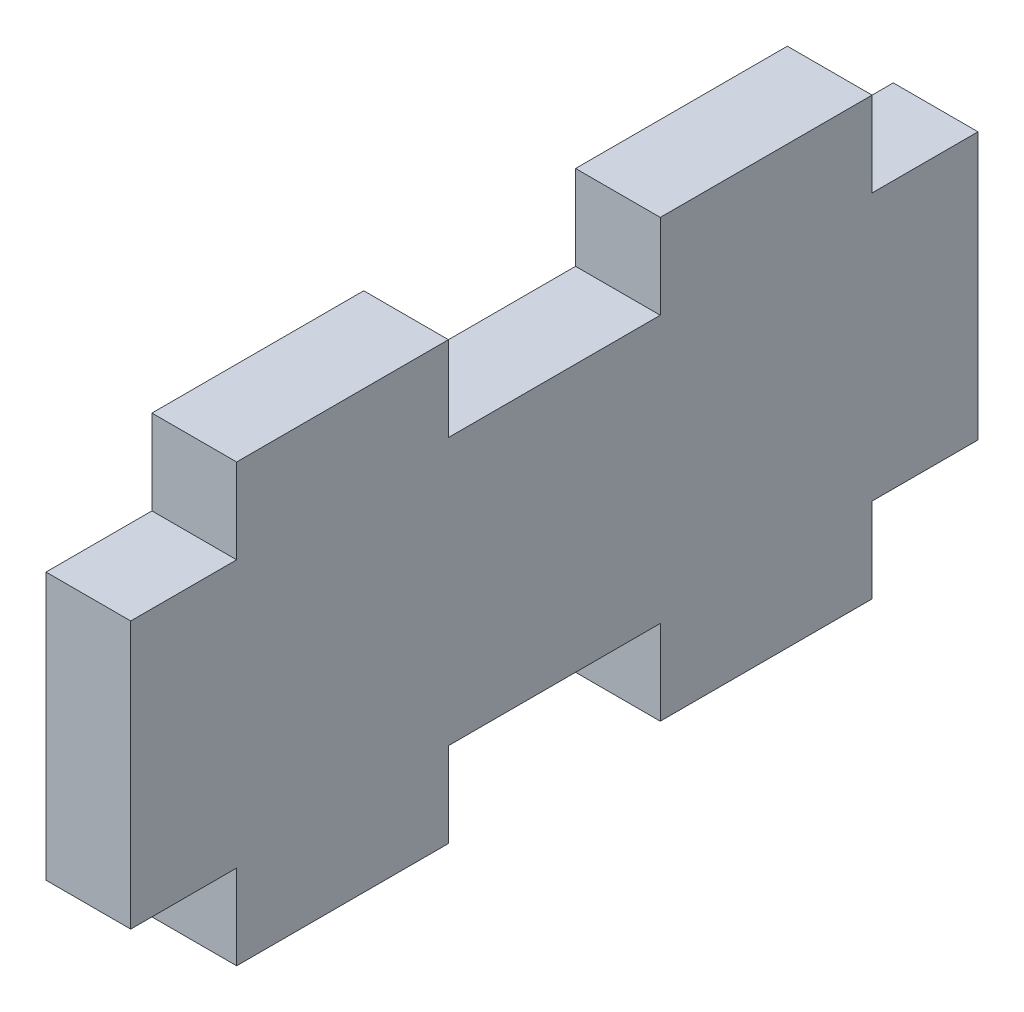
ISO-10303-21;
HEADER;
FILE_DESCRIPTION(('STEP AP214'),'2;1');
FILE_NAME('part.step','',(''),(''),'','','');
FILE_SCHEMA(('AUTOMOTIVE_DESIGN { 1 0 10303 214 1 1 1 1 }'));
ENDSEC;
DATA;
#1=APPLICATION_CONTEXT('core data for automotive mechanical design processes');
#2=APPLICATION_PROTOCOL_DEFINITION('international standard','automotive_design',2000,#1);
#3=PRODUCT_CONTEXT('',#1,'mechanical');
#4=PRODUCT('Part','Part','',(#3));
#5=PRODUCT_RELATED_PRODUCT_CATEGORY('part','',(#4));
#6=PRODUCT_DEFINITION_FORMATION('','',#4);
#7=PRODUCT_DEFINITION_CONTEXT('part definition',#1,'design');
#8=PRODUCT_DEFINITION('design','',#6,#7);
#9=PRODUCT_DEFINITION_SHAPE('','',#8);
#10=(LENGTH_UNIT() NAMED_UNIT(*) SI_UNIT(.MILLI.,.METRE.));
#11=(NAMED_UNIT(*) PLANE_ANGLE_UNIT() SI_UNIT($,.RADIAN.));
#12=(NAMED_UNIT(*) SI_UNIT($,.STERADIAN.) SOLID_ANGLE_UNIT());
#13=UNCERTAINTY_MEASURE_WITH_UNIT(LENGTH_MEASURE(1.E-05),#10,'distance_accuracy_value','');
#14=(GEOMETRIC_REPRESENTATION_CONTEXT(3) GLOBAL_UNCERTAINTY_ASSIGNED_CONTEXT((#13)) GLOBAL_UNIT_ASSIGNED_CONTEXT((#10,
#11,#12)) REPRESENTATION_CONTEXT('',''));
#15=CARTESIAN_POINT('',(0.,0.,0.));
#16=DIRECTION('',(0.,0.,1.));
#17=DIRECTION('',(1.,0.,0.));
#18=AXIS2_PLACEMENT_3D('',#15,#16,#17);
#19=CARTESIAN_POINT('',(2.,-3.15,-7.5));
#20=DIRECTION('',(0.,1.,0.));
#21=DIRECTION('',(0.,0.,1.));
#22=AXIS2_PLACEMENT_3D('',#19,#20,#21);
#23=PLANE('',#22);
#24=DIRECTION('',(0.,0.,-1.));
#25=VECTOR('',#24,1.);
#26=CARTESIAN_POINT('',(0.,-3.15,-7.5));
#27=LINE('',#26,#25);
#28=CARTESIAN_POINT('',(0.,-3.15,-7.5));
#29=VERTEX_POINT('',#28);
#30=CARTESIAN_POINT('',(0.,-3.15,-10.));
#31=VERTEX_POINT('',#30);
#32=EDGE_CURVE('E201',#29,#31,#27,.T.);
#33=ORIENTED_EDGE('',*,*,#32,.T.);
#34=DIRECTION('',(-1.,0.,0.));
#35=VECTOR('',#34,1.);
#36=CARTESIAN_POINT('',(2.,-3.15,-10.));
#37=LINE('',#36,#35);
#38=CARTESIAN_POINT('',(2.,-3.15,-10.));
#39=VERTEX_POINT('',#38);
#40=EDGE_CURVE('E11',#39,#31,#37,.T.);
#41=ORIENTED_EDGE('',*,*,#40,.F.);
#42=DIRECTION('',(0.,0.,-1.));
#43=VECTOR('',#42,1.);
#44=CARTESIAN_POINT('',(2.,-3.15,-7.5));
#45=LINE('',#44,#43);
#46=CARTESIAN_POINT('',(2.,-3.15,-7.5));
#47=VERTEX_POINT('',#46);
#48=EDGE_CURVE('E239',#47,#39,#45,.T.);
#49=ORIENTED_EDGE('',*,*,#48,.F.);
#50=DIRECTION('',(-1.,0.,0.));
#51=VECTOR('',#50,1.);
#52=CARTESIAN_POINT('',(2.,-3.15,-7.5));
#53=LINE('',#52,#51);
#54=EDGE_CURVE('E197',#47,#29,#53,.T.);
#55=ORIENTED_EDGE('',*,*,#54,.T.);
#56=EDGE_LOOP('',(#33,#41,#49,#55));
#57=FACE_BOUND('',#56,.T.);
#58=ADVANCED_FACE('F33',(#57),#23,.F.);
#59=CARTESIAN_POINT('',(2.,3.15,-10.));
#60=DIRECTION('',(0.,0.,1.));
#61=DIRECTION('',(1.,0.,0.));
#62=AXIS2_PLACEMENT_3D('',#59,#60,#61);
#63=PLANE('',#62);
#64=DIRECTION('',(0.,1.,0.));
#65=VECTOR('',#64,1.);
#66=CARTESIAN_POINT('',(0.,3.15,-10.));
#67=LINE('',#66,#65);
#68=CARTESIAN_POINT('',(0.,3.15,-10.));
#69=VERTEX_POINT('',#68);
#70=EDGE_CURVE('E204',#31,#69,#67,.T.);
#71=ORIENTED_EDGE('',*,*,#70,.T.);
#72=DIRECTION('',(-1.,0.,0.));
#73=VECTOR('',#72,1.);
#74=CARTESIAN_POINT('',(2.,3.15,-10.));
#75=LINE('',#74,#73);
#76=CARTESIAN_POINT('',(2.,3.15,-10.));
#77=VERTEX_POINT('',#76);
#78=EDGE_CURVE('E41',#77,#69,#75,.T.);
#79=ORIENTED_EDGE('',*,*,#78,.F.);
#80=DIRECTION('',(0.,1.,0.));
#81=VECTOR('',#80,1.);
#82=CARTESIAN_POINT('',(2.,3.15,-10.));
#83=LINE('',#82,#81);
#84=EDGE_CURVE('E128',#39,#77,#83,.T.);
#85=ORIENTED_EDGE('',*,*,#84,.F.);
#86=ORIENTED_EDGE('',*,*,#40,.T.);
#87=EDGE_LOOP('',(#71,#79,#85,#86));
#88=FACE_BOUND('',#87,.T.);
#89=ADVANCED_FACE('F357',(#88),#63,.F.);
#90=CARTESIAN_POINT('',(2.,3.15,-7.5));
#91=DIRECTION('',(0.,-1.,0.));
#92=DIRECTION('',(0.,0.,-1.));
#93=AXIS2_PLACEMENT_3D('',#90,#91,#92);
#94=PLANE('',#93);
#95=DIRECTION('',(0.,0.,1.));
#96=VECTOR('',#95,1.);
#97=CARTESIAN_POINT('',(0.,3.15,-7.5));
#98=LINE('',#97,#96);
#99=CARTESIAN_POINT('',(0.,3.15,-7.5));
#100=VERTEX_POINT('',#99);
#101=EDGE_CURVE('E206',#69,#100,#98,.T.);
#102=ORIENTED_EDGE('',*,*,#101,.T.);
#103=DIRECTION('',(-1.,0.,0.));
#104=VECTOR('',#103,1.);
#105=CARTESIAN_POINT('',(2.,3.15,-7.5));
#106=LINE('',#105,#104);
#107=CARTESIAN_POINT('',(2.,3.15,-7.5));
#108=VERTEX_POINT('',#107);
#109=EDGE_CURVE('E282',#108,#100,#106,.T.);
#110=ORIENTED_EDGE('',*,*,#109,.F.);
#111=DIRECTION('',(0.,0.,1.));
#112=VECTOR('',#111,1.);
#113=CARTESIAN_POINT('',(2.,3.15,-7.5));
#114=LINE('',#113,#112);
#115=EDGE_CURVE('E290',#77,#108,#114,.T.);
#116=ORIENTED_EDGE('',*,*,#115,.F.);
#117=ORIENTED_EDGE('',*,*,#78,.T.);
#118=EDGE_LOOP('',(#102,#110,#116,#117));
#119=FACE_BOUND('',#118,.T.);
#120=ADVANCED_FACE('F288',(#119),#94,.F.);
#121=CARTESIAN_POINT('',(2.,5.15,-7.5));
#122=DIRECTION('',(0.,0.,1.));
#123=DIRECTION('',(0.,-1.,0.));
#124=AXIS2_PLACEMENT_3D('',#121,#122,#123);
#125=PLANE('',#124);
#126=DIRECTION('',(0.,1.,0.));
#127=VECTOR('',#126,1.);
#128=CARTESIAN_POINT('',(0.,5.15,-7.5));
#129=LINE('',#128,#127);
#130=CARTESIAN_POINT('',(0.,5.15,-7.5));
#131=VERTEX_POINT('',#130);
#132=EDGE_CURVE('E208',#100,#131,#129,.T.);
#133=ORIENTED_EDGE('',*,*,#132,.T.);
#134=DIRECTION('',(-1.,0.,0.));
#135=VECTOR('',#134,1.);
#136=CARTESIAN_POINT('',(2.,5.15,-7.5));
#137=LINE('',#136,#135);
#138=CARTESIAN_POINT('',(2.,5.15,-7.5));
#139=VERTEX_POINT('',#138);
#140=EDGE_CURVE('E279',#139,#131,#137,.T.);
#141=ORIENTED_EDGE('',*,*,#140,.F.);
#142=DIRECTION('',(0.,1.,0.));
#143=VECTOR('',#142,1.);
#144=CARTESIAN_POINT('',(2.,5.15,-7.5));
#145=LINE('',#144,#143);
#146=EDGE_CURVE('E308',#108,#139,#145,.T.);
#147=ORIENTED_EDGE('',*,*,#146,.F.);
#148=ORIENTED_EDGE('',*,*,#109,.T.);
#149=EDGE_LOOP('',(#133,#141,#147,#148));
#150=FACE_BOUND('',#149,.T.);
#151=ADVANCED_FACE('F299',(#150),#125,.F.);
#152=CARTESIAN_POINT('',(2.,5.15,-2.5));
#153=DIRECTION('',(0.,-1.,0.));
#154=DIRECTION('',(0.,0.,-1.));
#155=AXIS2_PLACEMENT_3D('',#152,#153,#154);
#156=PLANE('',#155);
#157=DIRECTION('',(0.,0.,1.));
#158=VECTOR('',#157,1.);
#159=CARTESIAN_POINT('',(0.,5.15,-2.5));
#160=LINE('',#159,#158);
#161=CARTESIAN_POINT('',(0.,5.15,-2.5));
#162=VERTEX_POINT('',#161);
#163=EDGE_CURVE('E210',#131,#162,#160,.T.);
#164=ORIENTED_EDGE('',*,*,#163,.T.);
#165=DIRECTION('',(-1.,0.,0.));
#166=VECTOR('',#165,1.);
#167=CARTESIAN_POINT('',(2.,5.15,-2.5));
#168=LINE('',#167,#166);
#169=CARTESIAN_POINT('',(2.,5.15,-2.5));
#170=VERTEX_POINT('',#169);
#171=EDGE_CURVE('E276',#170,#162,#168,.T.);
#172=ORIENTED_EDGE('',*,*,#171,.F.);
#173=DIRECTION('',(0.,0.,1.));
#174=VECTOR('',#173,1.);
#175=CARTESIAN_POINT('',(2.,5.15,-2.5));
#176=LINE('',#175,#174);
#177=EDGE_CURVE('E305',#139,#170,#176,.T.);
#178=ORIENTED_EDGE('',*,*,#177,.F.);
#179=ORIENTED_EDGE('',*,*,#140,.T.);
#180=EDGE_LOOP('',(#164,#172,#178,#179));
#181=FACE_BOUND('',#180,.T.);
#182=ADVANCED_FACE('F303',(#181),#156,.F.);
#183=CARTESIAN_POINT('',(2.,3.15,-2.5));
#184=DIRECTION('',(0.,0.,-1.));
#185=DIRECTION('',(0.,1.,0.));
#186=AXIS2_PLACEMENT_3D('',#183,#184,#185);
#187=PLANE('',#186);
#188=DIRECTION('',(0.,-1.,0.));
#189=VECTOR('',#188,1.);
#190=CARTESIAN_POINT('',(0.,3.15,-2.5));
#191=LINE('',#190,#189);
#192=CARTESIAN_POINT('',(0.,3.15,-2.5));
#193=VERTEX_POINT('',#192);
#194=EDGE_CURVE('E212',#162,#193,#191,.T.);
#195=ORIENTED_EDGE('',*,*,#194,.T.);
#196=DIRECTION('',(-1.,0.,0.));
#197=VECTOR('',#196,1.);
#198=CARTESIAN_POINT('',(2.,3.15,-2.5));
#199=LINE('',#198,#197);
#200=CARTESIAN_POINT('',(2.,3.15,-2.5));
#201=VERTEX_POINT('',#200);
#202=EDGE_CURVE('E273',#201,#193,#199,.T.);
#203=ORIENTED_EDGE('',*,*,#202,.F.);
#204=DIRECTION('',(0.,-1.,0.));
#205=VECTOR('',#204,1.);
#206=CARTESIAN_POINT('',(2.,3.15,-2.5));
#207=LINE('',#206,#205);
#208=EDGE_CURVE('E307',#170,#201,#207,.T.);
#209=ORIENTED_EDGE('',*,*,#208,.F.);
#210=ORIENTED_EDGE('',*,*,#171,.T.);
#211=EDGE_LOOP('',(#195,#203,#209,#210));
#212=FACE_BOUND('',#211,.T.);
#213=ADVANCED_FACE('F370',(#212),#187,.F.);
#214=CARTESIAN_POINT('',(2.,3.15,2.5));
#215=DIRECTION('',(0.,-1.,0.));
#216=DIRECTION('',(0.,0.,-1.));
#217=AXIS2_PLACEMENT_3D('',#214,#215,#216);
#218=PLANE('',#217);
#219=DIRECTION('',(0.,0.,1.));
#220=VECTOR('',#219,1.);
#221=CARTESIAN_POINT('',(0.,3.15,2.5));
#222=LINE('',#221,#220);
#223=CARTESIAN_POINT('',(0.,3.15,2.5));
#224=VERTEX_POINT('',#223);
#225=EDGE_CURVE('E214',#193,#224,#222,.T.);
#226=ORIENTED_EDGE('',*,*,#225,.T.);
#227=DIRECTION('',(-1.,0.,0.));
#228=VECTOR('',#227,1.);
#229=CARTESIAN_POINT('',(2.,3.15,2.5));
#230=LINE('',#229,#228);
#231=CARTESIAN_POINT('',(2.,3.15,2.5));
#232=VERTEX_POINT('',#231);
#233=EDGE_CURVE('E270',#232,#224,#230,.T.);
#234=ORIENTED_EDGE('',*,*,#233,.F.);
#235=DIRECTION('',(0.,0.,1.));
#236=VECTOR('',#235,1.);
#237=CARTESIAN_POINT('',(2.,3.15,2.5));
#238=LINE('',#237,#236);
#239=EDGE_CURVE('E310',#201,#232,#238,.T.);
#240=ORIENTED_EDGE('',*,*,#239,.F.);
#241=ORIENTED_EDGE('',*,*,#202,.T.);
#242=EDGE_LOOP('',(#226,#234,#240,#241));
#243=FACE_BOUND('',#242,.T.);
#244=ADVANCED_FACE('F373',(#243),#218,.F.);
#245=CARTESIAN_POINT('',(2.,5.15,2.5));
#246=DIRECTION('',(0.,0.,1.));
#247=DIRECTION('',(0.,-1.,0.));
#248=AXIS2_PLACEMENT_3D('',#245,#246,#247);
#249=PLANE('',#248);
#250=DIRECTION('',(0.,1.,0.));
#251=VECTOR('',#250,1.);
#252=CARTESIAN_POINT('',(0.,5.15,2.5));
#253=LINE('',#252,#251);
#254=CARTESIAN_POINT('',(0.,5.15,2.5));
#255=VERTEX_POINT('',#254);
#256=EDGE_CURVE('E216',#224,#255,#253,.T.);
#257=ORIENTED_EDGE('',*,*,#256,.T.);
#258=DIRECTION('',(-1.,0.,0.));
#259=VECTOR('',#258,1.);
#260=CARTESIAN_POINT('',(2.,5.15,2.5));
#261=LINE('',#260,#259);
#262=CARTESIAN_POINT('',(2.,5.15,2.5));
#263=VERTEX_POINT('',#262);
#264=EDGE_CURVE('E267',#263,#255,#261,.T.);
#265=ORIENTED_EDGE('',*,*,#264,.F.);
#266=DIRECTION('',(0.,1.,0.));
#267=VECTOR('',#266,1.);
#268=CARTESIAN_POINT('',(2.,5.15,2.5));
#269=LINE('',#268,#267);
#270=EDGE_CURVE('E316',#232,#263,#269,.T.);
#271=ORIENTED_EDGE('',*,*,#270,.F.);
#272=ORIENTED_EDGE('',*,*,#233,.T.);
#273=EDGE_LOOP('',(#257,#265,#271,#272));
#274=FACE_BOUND('',#273,.T.);
#275=ADVANCED_FACE('F377',(#274),#249,.F.);
#276=CARTESIAN_POINT('',(2.,5.15,7.5));
#277=DIRECTION('',(0.,-1.,0.));
#278=DIRECTION('',(0.,0.,-1.));
#279=AXIS2_PLACEMENT_3D('',#276,#277,#278);
#280=PLANE('',#279);
#281=DIRECTION('',(0.,0.,1.));
#282=VECTOR('',#281,1.);
#283=CARTESIAN_POINT('',(0.,5.15,7.5));
#284=LINE('',#283,#282);
#285=CARTESIAN_POINT('',(0.,5.15,7.5));
#286=VERTEX_POINT('',#285);
#287=EDGE_CURVE('E218',#255,#286,#284,.T.);
#288=ORIENTED_EDGE('',*,*,#287,.T.);
#289=DIRECTION('',(-1.,0.,0.));
#290=VECTOR('',#289,1.);
#291=CARTESIAN_POINT('',(2.,5.15,7.5));
#292=LINE('',#291,#290);
#293=CARTESIAN_POINT('',(2.,5.15,7.5));
#294=VERTEX_POINT('',#293);
#295=EDGE_CURVE('E264',#294,#286,#292,.T.);
#296=ORIENTED_EDGE('',*,*,#295,.F.);
#297=DIRECTION('',(0.,0.,1.));
#298=VECTOR('',#297,1.);
#299=CARTESIAN_POINT('',(2.,5.15,7.5));
#300=LINE('',#299,#298);
#301=EDGE_CURVE('E318',#263,#294,#300,.T.);
#302=ORIENTED_EDGE('',*,*,#301,.F.);
#303=ORIENTED_EDGE('',*,*,#264,.T.);
#304=EDGE_LOOP('',(#288,#296,#302,#303));
#305=FACE_BOUND('',#304,.T.);
#306=ADVANCED_FACE('F381',(#305),#280,.F.);
#307=CARTESIAN_POINT('',(2.,3.15,7.5));
#308=DIRECTION('',(0.,0.,-1.));
#309=DIRECTION('',(-1.,0.,0.));
#310=AXIS2_PLACEMENT_3D('',#307,#308,#309);
#311=PLANE('',#310);
#312=DIRECTION('',(0.,-1.,0.));
#313=VECTOR('',#312,1.);
#314=CARTESIAN_POINT('',(0.,3.15,7.5));
#315=LINE('',#314,#313);
#316=CARTESIAN_POINT('',(0.,3.15,7.5));
#317=VERTEX_POINT('',#316);
#318=EDGE_CURVE('E220',#286,#317,#315,.T.);
#319=ORIENTED_EDGE('',*,*,#318,.T.);
#320=DIRECTION('',(-1.,0.,0.));
#321=VECTOR('',#320,1.);
#322=CARTESIAN_POINT('',(2.,3.15,7.5));
#323=LINE('',#322,#321);
#324=CARTESIAN_POINT('',(2.,3.15,7.5));
#325=VERTEX_POINT('',#324);
#326=EDGE_CURVE('E261',#325,#317,#323,.T.);
#327=ORIENTED_EDGE('',*,*,#326,.F.);
#328=DIRECTION('',(0.,-1.,0.));
#329=VECTOR('',#328,1.);
#330=CARTESIAN_POINT('',(2.,3.15,7.5));
#331=LINE('',#330,#329);
#332=EDGE_CURVE('E320',#294,#325,#331,.T.);
#333=ORIENTED_EDGE('',*,*,#332,.F.);
#334=ORIENTED_EDGE('',*,*,#295,.T.);
#335=EDGE_LOOP('',(#319,#327,#333,#334));
#336=FACE_BOUND('',#335,.T.);
#337=ADVANCED_FACE('F385',(#336),#311,.F.);
#338=CARTESIAN_POINT('',(2.,3.15,10.));
#339=DIRECTION('',(0.,-1.,0.));
#340=DIRECTION('',(0.,0.,-1.));
#341=AXIS2_PLACEMENT_3D('',#338,#339,#340);
#342=PLANE('',#341);
#343=DIRECTION('',(0.,0.,1.));
#344=VECTOR('',#343,1.);
#345=CARTESIAN_POINT('',(0.,3.15,10.));
#346=LINE('',#345,#344);
#347=CARTESIAN_POINT('',(0.,3.15,10.));
#348=VERTEX_POINT('',#347);
#349=EDGE_CURVE('E222',#317,#348,#346,.T.);
#350=ORIENTED_EDGE('',*,*,#349,.T.);
#351=DIRECTION('',(-1.,0.,0.));
#352=VECTOR('',#351,1.);
#353=CARTESIAN_POINT('',(2.,3.15,10.));
#354=LINE('',#353,#352);
#355=CARTESIAN_POINT('',(2.,3.15,10.));
#356=VERTEX_POINT('',#355);
#357=EDGE_CURVE('E258',#356,#348,#354,.T.);
#358=ORIENTED_EDGE('',*,*,#357,.F.);
#359=DIRECTION('',(0.,0.,1.));
#360=VECTOR('',#359,1.);
#361=CARTESIAN_POINT('',(2.,3.15,10.));
#362=LINE('',#361,#360);
#363=EDGE_CURVE('E322',#325,#356,#362,.T.);
#364=ORIENTED_EDGE('',*,*,#363,.F.);
#365=ORIENTED_EDGE('',*,*,#326,.T.);
#366=EDGE_LOOP('',(#350,#358,#364,#365));
#367=FACE_BOUND('',#366,.T.);
#368=ADVANCED_FACE('F389',(#367),#342,.F.);
#369=CARTESIAN_POINT('',(2.,3.15,10.));
#370=DIRECTION('',(0.,0.,-1.));
#371=DIRECTION('',(-1.,0.,0.));
#372=AXIS2_PLACEMENT_3D('',#369,#370,#371);
#373=PLANE('',#372);
#374=DIRECTION('',(0.,-1.,0.));
#375=VECTOR('',#374,1.);
#376=CARTESIAN_POINT('',(0.,3.15,10.));
#377=LINE('',#376,#375);
#378=CARTESIAN_POINT('',(0.,-3.15,10.));
#379=VERTEX_POINT('',#378);
#380=EDGE_CURVE('E224',#348,#379,#377,.T.);
#381=ORIENTED_EDGE('',*,*,#380,.T.);
#382=DIRECTION('',(-1.,0.,0.));
#383=VECTOR('',#382,1.);
#384=CARTESIAN_POINT('',(2.,-3.15,10.));
#385=LINE('',#384,#383);
#386=CARTESIAN_POINT('',(2.,-3.15,10.));
#387=VERTEX_POINT('',#386);
#388=EDGE_CURVE('E255',#387,#379,#385,.T.);
#389=ORIENTED_EDGE('',*,*,#388,.F.);
#390=DIRECTION('',(0.,-1.,0.));
#391=VECTOR('',#390,1.);
#392=CARTESIAN_POINT('',(2.,3.15,10.));
#393=LINE('',#392,#391);
#394=EDGE_CURVE('E324',#356,#387,#393,.T.);
#395=ORIENTED_EDGE('',*,*,#394,.F.);
#396=ORIENTED_EDGE('',*,*,#357,.T.);
#397=EDGE_LOOP('',(#381,#389,#395,#396));
#398=FACE_BOUND('',#397,.T.);
#399=ADVANCED_FACE('F393',(#398),#373,.F.);
#400=CARTESIAN_POINT('',(2.,-3.15,10.));
#401=DIRECTION('',(0.,1.,0.));
#402=DIRECTION('',(0.,0.,1.));
#403=AXIS2_PLACEMENT_3D('',#400,#401,#402);
#404=PLANE('',#403);
#405=DIRECTION('',(0.,0.,-1.));
#406=VECTOR('',#405,1.);
#407=CARTESIAN_POINT('',(0.,-3.15,10.));
#408=LINE('',#407,#406);
#409=CARTESIAN_POINT('',(0.,-3.15,7.5));
#410=VERTEX_POINT('',#409);
#411=EDGE_CURVE('E226',#379,#410,#408,.T.);
#412=ORIENTED_EDGE('',*,*,#411,.T.);
#413=DIRECTION('',(-1.,0.,0.));
#414=VECTOR('',#413,1.);
#415=CARTESIAN_POINT('',(2.,-3.15,7.5));
#416=LINE('',#415,#414);
#417=CARTESIAN_POINT('',(2.,-3.15,7.5));
#418=VERTEX_POINT('',#417);
#419=EDGE_CURVE('E252',#418,#410,#416,.T.);
#420=ORIENTED_EDGE('',*,*,#419,.F.);
#421=DIRECTION('',(0.,0.,-1.));
#422=VECTOR('',#421,1.);
#423=CARTESIAN_POINT('',(2.,-3.15,10.));
#424=LINE('',#423,#422);
#425=EDGE_CURVE('E326',#387,#418,#424,.T.);
#426=ORIENTED_EDGE('',*,*,#425,.F.);
#427=ORIENTED_EDGE('',*,*,#388,.T.);
#428=EDGE_LOOP('',(#412,#420,#426,#427));
#429=FACE_BOUND('',#428,.T.);
#430=ADVANCED_FACE('F397',(#429),#404,.F.);
#431=CARTESIAN_POINT('',(2.,-3.15,7.5));
#432=DIRECTION('',(0.,0.,-1.));
#433=DIRECTION('',(-1.,0.,0.));
#434=AXIS2_PLACEMENT_3D('',#431,#432,#433);
#435=PLANE('',#434);
#436=DIRECTION('',(0.,-1.,0.));
#437=VECTOR('',#436,1.);
#438=CARTESIAN_POINT('',(0.,-3.15,7.5));
#439=LINE('',#438,#437);
#440=CARTESIAN_POINT('',(0.,-5.15,7.5));
#441=VERTEX_POINT('',#440);
#442=EDGE_CURVE('E228',#410,#441,#439,.T.);
#443=ORIENTED_EDGE('',*,*,#442,.T.);
#444=DIRECTION('',(-1.,0.,0.));
#445=VECTOR('',#444,1.);
#446=CARTESIAN_POINT('',(2.,-5.15,7.5));
#447=LINE('',#446,#445);
#448=CARTESIAN_POINT('',(2.,-5.15,7.5));
#449=VERTEX_POINT('',#448);
#450=EDGE_CURVE('E249',#449,#441,#447,.T.);
#451=ORIENTED_EDGE('',*,*,#450,.F.);
#452=DIRECTION('',(0.,-1.,0.));
#453=VECTOR('',#452,1.);
#454=CARTESIAN_POINT('',(2.,-3.15,7.5));
#455=LINE('',#454,#453);
#456=EDGE_CURVE('E328',#418,#449,#455,.T.);
#457=ORIENTED_EDGE('',*,*,#456,.F.);
#458=ORIENTED_EDGE('',*,*,#419,.T.);
#459=EDGE_LOOP('',(#443,#451,#457,#458));
#460=FACE_BOUND('',#459,.T.);
#461=ADVANCED_FACE('F401',(#460),#435,.F.);
#462=CARTESIAN_POINT('',(2.,-5.15,7.5));
#463=DIRECTION('',(0.,1.,0.));
#464=DIRECTION('',(0.,0.,1.));
#465=AXIS2_PLACEMENT_3D('',#462,#463,#464);
#466=PLANE('',#465);
#467=DIRECTION('',(0.,0.,-1.));
#468=VECTOR('',#467,1.);
#469=CARTESIAN_POINT('',(0.,-5.15,7.5));
#470=LINE('',#469,#468);
#471=CARTESIAN_POINT('',(0.,-5.15,2.5));
#472=VERTEX_POINT('',#471);
#473=EDGE_CURVE('E230',#441,#472,#470,.T.);
#474=ORIENTED_EDGE('',*,*,#473,.T.);
#475=DIRECTION('',(-1.,0.,0.));
#476=VECTOR('',#475,1.);
#477=CARTESIAN_POINT('',(2.,-5.15,2.5));
#478=LINE('',#477,#476);
#479=CARTESIAN_POINT('',(2.,-5.15,2.5));
#480=VERTEX_POINT('',#479);
#481=EDGE_CURVE('E246',#480,#472,#478,.T.);
#482=ORIENTED_EDGE('',*,*,#481,.F.);
#483=DIRECTION('',(0.,0.,-1.));
#484=VECTOR('',#483,1.);
#485=CARTESIAN_POINT('',(2.,-5.15,7.5));
#486=LINE('',#485,#484);
#487=EDGE_CURVE('E330',#449,#480,#486,.T.);
#488=ORIENTED_EDGE('',*,*,#487,.F.);
#489=ORIENTED_EDGE('',*,*,#450,.T.);
#490=EDGE_LOOP('',(#474,#482,#488,#489));
#491=FACE_BOUND('',#490,.T.);
#492=ADVANCED_FACE('F405',(#491),#466,.F.);
#493=CARTESIAN_POINT('',(2.,-5.15,2.5));
#494=DIRECTION('',(0.,0.,1.));
#495=DIRECTION('',(1.,0.,0.));
#496=AXIS2_PLACEMENT_3D('',#493,#494,#495);
#497=PLANE('',#496);
#498=DIRECTION('',(0.,1.,0.));
#499=VECTOR('',#498,1.);
#500=CARTESIAN_POINT('',(0.,-5.15,2.5));
#501=LINE('',#500,#499);
#502=CARTESIAN_POINT('',(0.,-3.15,2.5));
#503=VERTEX_POINT('',#502);
#504=EDGE_CURVE('E232',#472,#503,#501,.T.);
#505=ORIENTED_EDGE('',*,*,#504,.T.);
#506=DIRECTION('',(-1.,0.,0.));
#507=VECTOR('',#506,1.);
#508=CARTESIAN_POINT('',(2.,-3.15,2.5));
#509=LINE('',#508,#507);
#510=CARTESIAN_POINT('',(2.,-3.15,2.5));
#511=VERTEX_POINT('',#510);
#512=EDGE_CURVE('E243',#511,#503,#509,.T.);
#513=ORIENTED_EDGE('',*,*,#512,.F.);
#514=DIRECTION('',(0.,1.,0.));
#515=VECTOR('',#514,1.);
#516=CARTESIAN_POINT('',(2.,-5.15,2.5));
#517=LINE('',#516,#515);
#518=EDGE_CURVE('E332',#480,#511,#517,.T.);
#519=ORIENTED_EDGE('',*,*,#518,.F.);
#520=ORIENTED_EDGE('',*,*,#481,.T.);
#521=EDGE_LOOP('',(#505,#513,#519,#520));
#522=FACE_BOUND('',#521,.T.);
#523=ADVANCED_FACE('F338',(#522),#497,.F.);
#524=CARTESIAN_POINT('',(2.,-3.15,2.5));
#525=DIRECTION('',(0.,1.,0.));
#526=DIRECTION('',(0.,0.,1.));
#527=AXIS2_PLACEMENT_3D('',#524,#525,#526);
#528=PLANE('',#527);
#529=DIRECTION('',(0.,0.,-1.));
#530=VECTOR('',#529,1.);
#531=CARTESIAN_POINT('',(0.,-3.15,2.5));
#532=LINE('',#531,#530);
#533=CARTESIAN_POINT('',(0.,-3.15,-2.5));
#534=VERTEX_POINT('',#533);
#535=EDGE_CURVE('E234',#503,#534,#532,.T.);
#536=ORIENTED_EDGE('',*,*,#535,.T.);
#537=DIRECTION('',(-1.,0.,0.));
#538=VECTOR('',#537,1.);
#539=CARTESIAN_POINT('',(2.,-3.15,-2.5));
#540=LINE('',#539,#538);
#541=CARTESIAN_POINT('',(2.,-3.15,-2.5));
#542=VERTEX_POINT('',#541);
#543=EDGE_CURVE('E192',#542,#534,#540,.T.);
#544=ORIENTED_EDGE('',*,*,#543,.F.);
#545=DIRECTION('',(0.,0.,-1.));
#546=VECTOR('',#545,1.);
#547=CARTESIAN_POINT('',(2.,-3.15,2.5));
#548=LINE('',#547,#546);
#549=EDGE_CURVE('E183',#511,#542,#548,.T.);
#550=ORIENTED_EDGE('',*,*,#549,.F.);
#551=ORIENTED_EDGE('',*,*,#512,.T.);
#552=EDGE_LOOP('',(#536,#544,#550,#551));
#553=FACE_BOUND('',#552,.T.);
#554=ADVANCED_FACE('F342',(#553),#528,.F.);
#555=CARTESIAN_POINT('',(2.,-5.15,-2.5));
#556=DIRECTION('',(0.,0.,-1.));
#557=DIRECTION('',(0.,1.,0.));
#558=AXIS2_PLACEMENT_3D('',#555,#556,#557);
#559=PLANE('',#558);
#560=DIRECTION('',(0.,-1.,0.));
#561=VECTOR('',#560,1.);
#562=CARTESIAN_POINT('',(0.,-5.15,-2.5));
#563=LINE('',#562,#561);
#564=CARTESIAN_POINT('',(0.,-5.15,-2.5));
#565=VERTEX_POINT('',#564);
#566=EDGE_CURVE('E191',#534,#565,#563,.T.);
#567=ORIENTED_EDGE('',*,*,#566,.T.);
#568=DIRECTION('',(-1.,0.,0.));
#569=VECTOR('',#568,1.);
#570=CARTESIAN_POINT('',(2.,-5.15,-2.5));
#571=LINE('',#570,#569);
#572=CARTESIAN_POINT('',(2.,-5.15,-2.5));
#573=VERTEX_POINT('',#572);
#574=EDGE_CURVE('E188',#573,#565,#571,.T.);
#575=ORIENTED_EDGE('',*,*,#574,.F.);
#576=DIRECTION('',(0.,-1.,0.));
#577=VECTOR('',#576,1.);
#578=CARTESIAN_POINT('',(2.,-5.15,-2.5));
#579=LINE('',#578,#577);
#580=EDGE_CURVE('E177',#542,#573,#579,.T.);
#581=ORIENTED_EDGE('',*,*,#580,.F.);
#582=ORIENTED_EDGE('',*,*,#543,.T.);
#583=EDGE_LOOP('',(#567,#575,#581,#582));
#584=FACE_BOUND('',#583,.T.);
#585=ADVANCED_FACE('F189',(#584),#559,.F.);
#586=CARTESIAN_POINT('',(2.,-5.15,-7.5));
#587=DIRECTION('',(0.,1.,0.));
#588=DIRECTION('',(0.,0.,1.));
#589=AXIS2_PLACEMENT_3D('',#586,#587,#588);
#590=PLANE('',#589);
#591=DIRECTION('',(0.,0.,-1.));
#592=VECTOR('',#591,1.);
#593=CARTESIAN_POINT('',(0.,-5.15,-7.5));
#594=LINE('',#593,#592);
#595=CARTESIAN_POINT('',(0.,-5.15,-7.5));
#596=VERTEX_POINT('',#595);
#597=EDGE_CURVE('E114',#565,#596,#594,.T.);
#598=ORIENTED_EDGE('',*,*,#597,.T.);
#599=DIRECTION('',(-1.,0.,0.));
#600=VECTOR('',#599,1.);
#601=CARTESIAN_POINT('',(2.,-5.15,-7.5));
#602=LINE('',#601,#600);
#603=CARTESIAN_POINT('',(2.,-5.15,-7.5));
#604=VERTEX_POINT('',#603);
#605=EDGE_CURVE('E193',#604,#596,#602,.T.);
#606=ORIENTED_EDGE('',*,*,#605,.F.);
#607=DIRECTION('',(0.,0.,-1.));
#608=VECTOR('',#607,1.);
#609=CARTESIAN_POINT('',(2.,-5.15,-7.5));
#610=LINE('',#609,#608);
#611=EDGE_CURVE('E181',#573,#604,#610,.T.);
#612=ORIENTED_EDGE('',*,*,#611,.F.);
#613=ORIENTED_EDGE('',*,*,#574,.T.);
#614=EDGE_LOOP('',(#598,#606,#612,#613));
#615=FACE_BOUND('',#614,.T.);
#616=ADVANCED_FACE('F195',(#615),#590,.F.);
#617=CARTESIAN_POINT('',(2.,-3.15,-7.5));
#618=DIRECTION('',(0.,0.,1.));
#619=DIRECTION('',(0.,-1.,0.));
#620=AXIS2_PLACEMENT_3D('',#617,#618,#619);
#621=PLANE('',#620);
#622=DIRECTION('',(0.,1.,0.));
#623=VECTOR('',#622,1.);
#624=CARTESIAN_POINT('',(0.,-3.15,-7.5));
#625=LINE('',#624,#623);
#626=EDGE_CURVE('E120',#596,#29,#625,.T.);
#627=ORIENTED_EDGE('',*,*,#626,.T.);
#628=ORIENTED_EDGE('',*,*,#54,.F.);
#629=DIRECTION('',(0.,1.,0.));
#630=VECTOR('',#629,1.);
#631=CARTESIAN_POINT('',(2.,-3.15,-7.5));
#632=LINE('',#631,#630);
#633=EDGE_CURVE('E49',#604,#47,#632,.T.);
#634=ORIENTED_EDGE('',*,*,#633,.F.);
#635=ORIENTED_EDGE('',*,*,#605,.T.);
#636=EDGE_LOOP('',(#627,#628,#634,#635));
#637=FACE_BOUND('',#636,.T.);
#638=ADVANCED_FACE('F346',(#637),#621,.F.);
#639=CARTESIAN_POINT('',(2.,0.,0.));
#640=DIRECTION('',(-1.,0.,0.));
#641=DIRECTION('',(0.,0.,1.));
#642=AXIS2_PLACEMENT_3D('',#639,#640,#641);
#643=PLANE('',#642);
#644=ORIENTED_EDGE('',*,*,#48,.T.);
#645=ORIENTED_EDGE('',*,*,#84,.T.);
#646=ORIENTED_EDGE('',*,*,#115,.T.);
#647=ORIENTED_EDGE('',*,*,#146,.T.);
#648=ORIENTED_EDGE('',*,*,#177,.T.);
#649=ORIENTED_EDGE('',*,*,#208,.T.);
#650=ORIENTED_EDGE('',*,*,#239,.T.);
#651=ORIENTED_EDGE('',*,*,#270,.T.);
#652=ORIENTED_EDGE('',*,*,#301,.T.);
#653=ORIENTED_EDGE('',*,*,#332,.T.);
#654=ORIENTED_EDGE('',*,*,#363,.T.);
#655=ORIENTED_EDGE('',*,*,#394,.T.);
#656=ORIENTED_EDGE('',*,*,#425,.T.);
#657=ORIENTED_EDGE('',*,*,#456,.T.);
#658=ORIENTED_EDGE('',*,*,#487,.T.);
#659=ORIENTED_EDGE('',*,*,#518,.T.);
#660=ORIENTED_EDGE('',*,*,#549,.T.);
#661=ORIENTED_EDGE('',*,*,#580,.T.);
#662=ORIENTED_EDGE('',*,*,#611,.T.);
#663=ORIENTED_EDGE('',*,*,#633,.T.);
#664=EDGE_LOOP('',(#644,#645,#646,#647,#648,#649,#650,#651,#652,#653,#654,#655,#656,#657,#658,
#659,#660,#661,#662,#663));
#665=FACE_BOUND('',#664,.T.);
#666=ADVANCED_FACE('F179',(#665),#643,.F.);
#667=CARTESIAN_POINT('',(0.,0.,0.));
#668=DIRECTION('',(-1.,0.,0.));
#669=DIRECTION('',(0.,0.,1.));
#670=AXIS2_PLACEMENT_3D('',#667,#668,#669);
#671=PLANE('',#670);
#672=ORIENTED_EDGE('',*,*,#32,.F.);
#673=ORIENTED_EDGE('',*,*,#626,.F.);
#674=ORIENTED_EDGE('',*,*,#597,.F.);
#675=ORIENTED_EDGE('',*,*,#566,.F.);
#676=ORIENTED_EDGE('',*,*,#535,.F.);
#677=ORIENTED_EDGE('',*,*,#504,.F.);
#678=ORIENTED_EDGE('',*,*,#473,.F.);
#679=ORIENTED_EDGE('',*,*,#442,.F.);
#680=ORIENTED_EDGE('',*,*,#411,.F.);
#681=ORIENTED_EDGE('',*,*,#380,.F.);
#682=ORIENTED_EDGE('',*,*,#349,.F.);
#683=ORIENTED_EDGE('',*,*,#318,.F.);
#684=ORIENTED_EDGE('',*,*,#287,.F.);
#685=ORIENTED_EDGE('',*,*,#256,.F.);
#686=ORIENTED_EDGE('',*,*,#225,.F.);
#687=ORIENTED_EDGE('',*,*,#194,.F.);
#688=ORIENTED_EDGE('',*,*,#163,.F.);
#689=ORIENTED_EDGE('',*,*,#132,.F.);
#690=ORIENTED_EDGE('',*,*,#101,.F.);
#691=ORIENTED_EDGE('',*,*,#70,.F.);
#692=EDGE_LOOP('',(#672,#673,#674,#675,#676,#677,#678,#679,#680,#681,#682,#683,#684,#685,#686,
#687,#688,#689,#690,#691));
#693=FACE_BOUND('',#692,.T.);
#694=ADVANCED_FACE('F294',(#693),#671,.T.);
#695=CLOSED_SHELL('',(#58,#89,#120,#151,#182,#213,#244,#275,#306,#337,#368,#399,#430,#461,#492,
#523,#554,#585,#616,#638,#666,#694));
#696=MANIFOLD_SOLID_BREP('B2',#695);
#697=ADVANCED_BREP_SHAPE_REPRESENTATION('',(#18,#696),#14);
#698=SHAPE_DEFINITION_REPRESENTATION(#9,#697);
ENDSEC;
END-ISO-10303-21;
